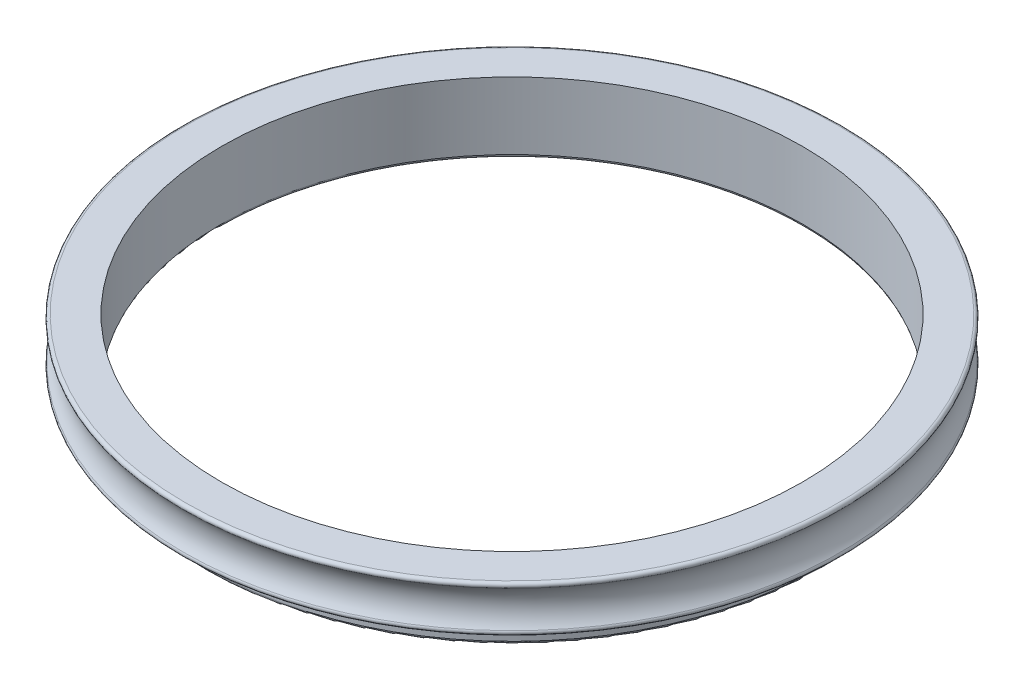
ISO-10303-21;
HEADER;
FILE_DESCRIPTION(('STEP AP214'),'2;1');
FILE_NAME('part.step','',(''),(''),'','','');
FILE_SCHEMA(('AUTOMOTIVE_DESIGN { 1 0 10303 214 1 1 1 1 }'));
ENDSEC;
DATA;
#1=APPLICATION_CONTEXT('core data for automotive mechanical design processes');
#2=APPLICATION_PROTOCOL_DEFINITION('international standard','automotive_design',2000,#1);
#3=PRODUCT_CONTEXT('',#1,'mechanical');
#4=PRODUCT('Part','Part','',(#3));
#5=PRODUCT_RELATED_PRODUCT_CATEGORY('part','',(#4));
#6=PRODUCT_DEFINITION_FORMATION('','',#4);
#7=PRODUCT_DEFINITION_CONTEXT('part definition',#1,'design');
#8=PRODUCT_DEFINITION('design','',#6,#7);
#9=PRODUCT_DEFINITION_SHAPE('','',#8);
#10=(LENGTH_UNIT() NAMED_UNIT(*) SI_UNIT(.MILLI.,.METRE.));
#11=(NAMED_UNIT(*) PLANE_ANGLE_UNIT() SI_UNIT($,.RADIAN.));
#12=(NAMED_UNIT(*) SI_UNIT($,.STERADIAN.) SOLID_ANGLE_UNIT());
#13=UNCERTAINTY_MEASURE_WITH_UNIT(LENGTH_MEASURE(1.E-05),#10,'distance_accuracy_value','');
#14=(GEOMETRIC_REPRESENTATION_CONTEXT(3) GLOBAL_UNCERTAINTY_ASSIGNED_CONTEXT((#13)) GLOBAL_UNIT_ASSIGNED_CONTEXT((#10,
#11,#12)) REPRESENTATION_CONTEXT('',''));
#15=CARTESIAN_POINT('',(0.,0.,0.));
#16=DIRECTION('',(0.,0.,1.));
#17=DIRECTION('',(1.,0.,0.));
#18=AXIS2_PLACEMENT_3D('',#15,#16,#17);
#19=CARTESIAN_POINT('',(0.,-3.7465,0.));
#20=DIRECTION('',(0.,1.,0.));
#21=DIRECTION('',(0.,0.,1.));
#22=AXIS2_PLACEMENT_3D('',#19,#20,#21);
#23=TOROIDAL_SURFACE('',#22,25.7175,0.254);
#24=CARTESIAN_POINT('',(0.,-4.0005,0.));
#25=DIRECTION('',(0.,-1.,0.));
#26=DIRECTION('',(0.,0.,1.));
#27=AXIS2_PLACEMENT_3D('',#24,#25,#26);
#28=CIRCLE('',#27,25.7175);
#29=CARTESIAN_POINT('',(0.,-4.0005,25.7175));
#30=VERTEX_POINT('',#29);
#31=EDGE_CURVE('E26',#30,#30,#28,.T.);
#32=ORIENTED_EDGE('',*,*,#31,.F.);
#33=EDGE_LOOP('',(#32));
#34=FACE_BOUND('',#33,.T.);
#35=CARTESIAN_POINT('',(0.,-3.7465,0.));
#36=DIRECTION('',(0.,1.,0.));
#37=DIRECTION('',(0.,0.,1.));
#38=AXIS2_PLACEMENT_3D('',#35,#36,#37);
#39=CIRCLE('',#38,25.9715);
#40=CARTESIAN_POINT('',(0.,-3.7465,25.9715));
#41=VERTEX_POINT('',#40);
#42=EDGE_CURVE('E12',#41,#41,#39,.T.);
#43=ORIENTED_EDGE('',*,*,#42,.F.);
#44=EDGE_LOOP('',(#43));
#45=FACE_BOUND('',#44,.T.);
#46=ADVANCED_FACE('F22',(#34,#45),#23,.T.);
#47=CARTESIAN_POINT('',(0.,-3.7465,0.));
#48=DIRECTION('',(0.,1.,0.));
#49=DIRECTION('',(0.,0.,1.));
#50=AXIS2_PLACEMENT_3D('',#47,#48,#49);
#51=TOROIDAL_SURFACE('',#50,24.9555,0.254);
#52=CARTESIAN_POINT('',(0.,-3.7465,0.));
#53=DIRECTION('',(0.,-1.,0.));
#54=DIRECTION('',(0.,0.,1.));
#55=AXIS2_PLACEMENT_3D('',#52,#53,#54);
#56=CIRCLE('',#55,24.7015);
#57=CARTESIAN_POINT('',(0.,-3.7465,24.7015));
#58=VERTEX_POINT('',#57);
#59=EDGE_CURVE('E33',#58,#58,#56,.T.);
#60=ORIENTED_EDGE('',*,*,#59,.F.);
#61=EDGE_LOOP('',(#60));
#62=FACE_BOUND('',#61,.T.);
#63=CARTESIAN_POINT('',(0.,-4.0005,0.));
#64=DIRECTION('',(0.,1.,0.));
#65=DIRECTION('',(0.,0.,1.));
#66=AXIS2_PLACEMENT_3D('',#63,#64,#65);
#67=CIRCLE('',#66,24.9555);
#68=CARTESIAN_POINT('',(0.,-4.0005,24.9555));
#69=VERTEX_POINT('',#68);
#70=EDGE_CURVE('E88',#69,#69,#67,.T.);
#71=ORIENTED_EDGE('',*,*,#70,.F.);
#72=EDGE_LOOP('',(#71));
#73=FACE_BOUND('',#72,.T.);
#74=ADVANCED_FACE('F97',(#62,#73),#51,.T.);
#75=CARTESIAN_POINT('',(0.,1.7145,0.));
#76=DIRECTION('',(0.,-1.,0.));
#77=DIRECTION('',(0.,0.,-1.));
#78=AXIS2_PLACEMENT_3D('',#75,#76,#77);
#79=TOROIDAL_SURFACE('',#78,27.7531889987129,0.254);
#80=CARTESIAN_POINT('',(0.,1.9685,0.));
#81=DIRECTION('',(0.,1.,0.));
#82=DIRECTION('',(0.,0.,1.));
#83=AXIS2_PLACEMENT_3D('',#80,#81,#82);
#84=CIRCLE('',#83,27.7531889987129);
#85=CARTESIAN_POINT('',(0.,1.9685,27.7531889987129));
#86=VERTEX_POINT('',#85);
#87=EDGE_CURVE('E75',#86,#86,#84,.T.);
#88=ORIENTED_EDGE('',*,*,#87,.F.);
#89=EDGE_LOOP('',(#88));
#90=FACE_BOUND('',#89,.T.);
#91=CARTESIAN_POINT('',(0.,1.55863636363634,0.));
#92=DIRECTION('',(0.,-1.,0.));
#93=DIRECTION('',(0.,0.,-1.));
#94=AXIS2_PLACEMENT_3D('',#91,#92,#93);
#95=CIRCLE('',#94,27.9537445442845);
#96=CARTESIAN_POINT('',(0.,1.55863636363634,-27.9537445442845));
#97=VERTEX_POINT('',#96);
#98=EDGE_CURVE('E70',#97,#97,#95,.T.);
#99=ORIENTED_EDGE('',*,*,#98,.F.);
#100=EDGE_LOOP('',(#99));
#101=FACE_BOUND('',#100,.T.);
#102=ADVANCED_FACE('F100',(#90,#101),#79,.T.);
#103=CARTESIAN_POINT('',(0.,-1.9685,0.));
#104=DIRECTION('',(0.,1.,0.));
#105=DIRECTION('',(0.,0.,-1.));
#106=AXIS2_PLACEMENT_3D('',#103,#104,#105);
#107=CYLINDRICAL_SURFACE('',#106,25.9715);
#108=ORIENTED_EDGE('',*,*,#42,.T.);
#109=EDGE_LOOP('',(#108));
#110=FACE_BOUND('',#109,.T.);
#111=CARTESIAN_POINT('',(0.,-2.3495,0.));
#112=DIRECTION('',(0.,-1.,0.));
#113=DIRECTION('',(0.,0.,1.));
#114=AXIS2_PLACEMENT_3D('',#111,#112,#113);
#115=CIRCLE('',#114,25.9715);
#116=CARTESIAN_POINT('',(0.,-2.3495,25.9715));
#117=VERTEX_POINT('',#116);
#118=EDGE_CURVE('E84',#117,#117,#115,.T.);
#119=ORIENTED_EDGE('',*,*,#118,.T.);
#120=EDGE_LOOP('',(#119));
#121=FACE_BOUND('',#120,.T.);
#122=ADVANCED_FACE('F156',(#110,#121),#107,.T.);
#123=CARTESIAN_POINT('',(0.,-85.1145889546557,0.));
#124=DIRECTION('',(0.,-1.,0.));
#125=DIRECTION('',(0.,0.,1.));
#126=AXIS2_PLACEMENT_3D('',#123,#124,#125);
#127=CYLINDRICAL_SURFACE('',#126,24.7015);
#128=CARTESIAN_POINT('',(0.,1.9685,0.));
#129=DIRECTION('',(0.,-1.,0.));
#130=DIRECTION('',(0.,0.,-1.));
#131=AXIS2_PLACEMENT_3D('',#128,#129,#130);
#132=CIRCLE('',#131,24.7015);
#133=CARTESIAN_POINT('',(0.,1.9685,-24.7015));
#134=VERTEX_POINT('',#133);
#135=EDGE_CURVE('E207',#134,#134,#132,.F.);
#136=ORIENTED_EDGE('',*,*,#135,.T.);
#137=EDGE_LOOP('',(#136));
#138=FACE_BOUND('',#137,.T.);
#139=ORIENTED_EDGE('',*,*,#59,.T.);
#140=EDGE_LOOP('',(#139));
#141=FACE_BOUND('',#140,.T.);
#142=ADVANCED_FACE('F95',(#138,#141),#127,.F.);
#143=CARTESIAN_POINT('',(0.,-4.0005,0.));
#144=DIRECTION('',(0.,1.,0.));
#145=DIRECTION('',(1.,0.,0.));
#146=AXIS2_PLACEMENT_3D('',#143,#144,#145);
#147=PLANE('',#146);
#148=ORIENTED_EDGE('',*,*,#70,.T.);
#149=EDGE_LOOP('',(#148));
#150=FACE_BOUND('',#149,.T.);
#151=ORIENTED_EDGE('',*,*,#31,.T.);
#152=EDGE_LOOP('',(#151));
#153=FACE_BOUND('',#152,.T.);
#154=ADVANCED_FACE('F104',(#150,#153),#147,.F.);
#155=CARTESIAN_POINT('',(0.,1.9685,0.));
#156=DIRECTION('',(0.,1.,0.));
#157=DIRECTION('',(1.,0.,0.));
#158=AXIS2_PLACEMENT_3D('',#155,#156,#157);
#159=PLANE('',#158);
#160=ORIENTED_EDGE('',*,*,#87,.T.);
#161=EDGE_LOOP('',(#160));
#162=FACE_BOUND('',#161,.T.);
#163=ORIENTED_EDGE('',*,*,#135,.F.);
#164=EDGE_LOOP('',(#163));
#165=FACE_BOUND('',#164,.T.);
#166=ADVANCED_FACE('F24',(#162,#165),#159,.T.);
#167=CARTESIAN_POINT('',(0.,-1.7145,0.));
#168=DIRECTION('',(0.,-1.,0.));
#169=DIRECTION('',(0.,0.,-1.));
#170=AXIS2_PLACEMENT_3D('',#167,#168,#169);
#171=TOROIDAL_SURFACE('',#170,27.7531889987129,0.254);
#172=CARTESIAN_POINT('',(0.,-1.55863636363636,0.));
#173=DIRECTION('',(0.,1.,0.));
#174=DIRECTION('',(0.,0.,1.));
#175=AXIS2_PLACEMENT_3D('',#172,#173,#174);
#176=CIRCLE('',#175,27.9537445442845);
#177=CARTESIAN_POINT('',(0.,-1.55863636363636,27.9537445442845));
#178=VERTEX_POINT('',#177);
#179=EDGE_CURVE('E76',#178,#178,#176,.T.);
#180=ORIENTED_EDGE('',*,*,#179,.F.);
#181=EDGE_LOOP('',(#180));
#182=FACE_BOUND('',#181,.T.);
#183=CARTESIAN_POINT('',(0.,-1.9685,0.));
#184=DIRECTION('',(0.,-1.,0.));
#185=DIRECTION('',(0.,0.,1.));
#186=AXIS2_PLACEMENT_3D('',#183,#184,#185);
#187=CIRCLE('',#186,27.7531889987129);
#188=CARTESIAN_POINT('',(0.,-1.9685,27.7531889987129));
#189=VERTEX_POINT('',#188);
#190=EDGE_CURVE('E203',#189,#189,#187,.T.);
#191=ORIENTED_EDGE('',*,*,#190,.F.);
#192=EDGE_LOOP('',(#191));
#193=FACE_BOUND('',#192,.T.);
#194=ADVANCED_FACE('F177',(#182,#193),#171,.T.);
#195=CARTESIAN_POINT('',(0.,0.,0.));
#196=DIRECTION('',(0.,1.,0.));
#197=DIRECTION('',(-1.,0.,0.));
#198=AXIS2_PLACEMENT_3D('',#195,#196,#197);
#199=TOROIDAL_SURFACE('',#198,29.9593,2.54);
#200=ORIENTED_EDGE('',*,*,#98,.T.);
#201=EDGE_LOOP('',(#200));
#202=FACE_BOUND('',#201,.T.);
#203=ORIENTED_EDGE('',*,*,#179,.T.);
#204=EDGE_LOOP('',(#203));
#205=FACE_BOUND('',#204,.T.);
#206=ADVANCED_FACE('F71',(#202,#205),#199,.F.);
#207=CARTESIAN_POINT('',(0.,-2.3495,0.));
#208=DIRECTION('',(0.,1.,0.));
#209=DIRECTION('',(0.,0.,1.));
#210=AXIS2_PLACEMENT_3D('',#207,#208,#209);
#211=TOROIDAL_SURFACE('',#210,26.3525,0.381);
#212=ORIENTED_EDGE('',*,*,#118,.F.);
#213=EDGE_LOOP('',(#212));
#214=FACE_BOUND('',#213,.T.);
#215=CARTESIAN_POINT('',(0.,-1.9685,0.));
#216=DIRECTION('',(0.,1.,0.));
#217=DIRECTION('',(0.,0.,1.));
#218=AXIS2_PLACEMENT_3D('',#215,#216,#217);
#219=CIRCLE('',#218,26.3525);
#220=CARTESIAN_POINT('',(0.,-1.9685,26.3525));
#221=VERTEX_POINT('',#220);
#222=EDGE_CURVE('E206',#221,#221,#219,.T.);
#223=ORIENTED_EDGE('',*,*,#222,.F.);
#224=EDGE_LOOP('',(#223));
#225=FACE_BOUND('',#224,.T.);
#226=ADVANCED_FACE('F121',(#214,#225),#211,.F.);
#227=CARTESIAN_POINT('',(0.,-1.9685,0.));
#228=DIRECTION('',(0.,1.,0.));
#229=DIRECTION('',(1.,0.,0.));
#230=AXIS2_PLACEMENT_3D('',#227,#228,#229);
#231=PLANE('',#230);
#232=ORIENTED_EDGE('',*,*,#222,.T.);
#233=EDGE_LOOP('',(#232));
#234=FACE_BOUND('',#233,.T.);
#235=ORIENTED_EDGE('',*,*,#190,.T.);
#236=EDGE_LOOP('',(#235));
#237=FACE_BOUND('',#236,.T.);
#238=ADVANCED_FACE('F116',(#234,#237),#231,.F.);
#239=CLOSED_SHELL('',(#46,#74,#102,#122,#142,#154,#166,#194,#206,#226,#238));
#240=MANIFOLD_SOLID_BREP('B1',#239);
#241=ADVANCED_BREP_SHAPE_REPRESENTATION('',(#18,#240),#14);
#242=SHAPE_DEFINITION_REPRESENTATION(#9,#241);
ENDSEC;
END-ISO-10303-21;
